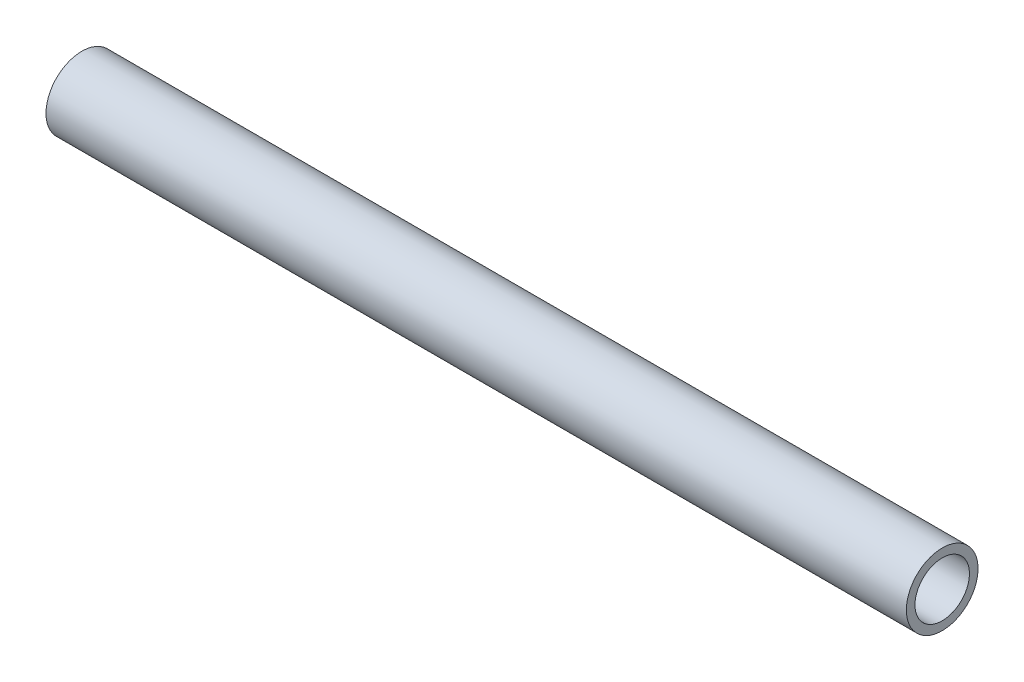
ISO-10303-21;
HEADER;
FILE_DESCRIPTION(('STEP AP214'),'2;1');
FILE_NAME('part.step','',(''),(''),'','','');
FILE_SCHEMA(('AUTOMOTIVE_DESIGN { 1 0 10303 214 1 1 1 1 }'));
ENDSEC;
DATA;
#1=APPLICATION_CONTEXT('core data for automotive mechanical design processes');
#2=APPLICATION_PROTOCOL_DEFINITION('international standard','automotive_design',2000,#1);
#3=PRODUCT_CONTEXT('',#1,'mechanical');
#4=PRODUCT('Part','Part','',(#3));
#5=PRODUCT_RELATED_PRODUCT_CATEGORY('part','',(#4));
#6=PRODUCT_DEFINITION_FORMATION('','',#4);
#7=PRODUCT_DEFINITION_CONTEXT('part definition',#1,'design');
#8=PRODUCT_DEFINITION('design','',#6,#7);
#9=PRODUCT_DEFINITION_SHAPE('','',#8);
#10=(LENGTH_UNIT() NAMED_UNIT(*) SI_UNIT(.MILLI.,.METRE.));
#11=(NAMED_UNIT(*) PLANE_ANGLE_UNIT() SI_UNIT($,.RADIAN.));
#12=(NAMED_UNIT(*) SI_UNIT($,.STERADIAN.) SOLID_ANGLE_UNIT());
#13=UNCERTAINTY_MEASURE_WITH_UNIT(LENGTH_MEASURE(1.E-05),#10,'distance_accuracy_value','');
#14=(GEOMETRIC_REPRESENTATION_CONTEXT(3) GLOBAL_UNCERTAINTY_ASSIGNED_CONTEXT((#13)) GLOBAL_UNIT_ASSIGNED_CONTEXT((#10,
#11,#12)) REPRESENTATION_CONTEXT('',''));
#15=CARTESIAN_POINT('',(0.,0.,0.));
#16=DIRECTION('',(0.,0.,1.));
#17=DIRECTION('',(1.,0.,0.));
#18=AXIS2_PLACEMENT_3D('',#15,#16,#17);
#19=CARTESIAN_POINT('',(304.8,0.,0.));
#20=DIRECTION('',(1.,0.,0.));
#21=DIRECTION('',(0.,0.,-1.));
#22=AXIS2_PLACEMENT_3D('',#19,#20,#21);
#23=PLANE('',#22);
#24=CARTESIAN_POINT('',(304.8,0.,0.));
#25=DIRECTION('',(1.,0.,0.));
#26=DIRECTION('',(0.,0.,-1.));
#27=AXIS2_PLACEMENT_3D('',#24,#25,#26);
#28=CIRCLE('',#27,12.7);
#29=CARTESIAN_POINT('',(304.8,0.,12.7));
#30=VERTEX_POINT('',#29);
#31=EDGE_CURVE('E10',#30,#30,#28,.T.);
#32=ORIENTED_EDGE('',*,*,#31,.T.);
#33=EDGE_LOOP('',(#32));
#34=FACE_BOUND('',#33,.T.);
#35=CARTESIAN_POINT('',(304.8,0.,0.));
#36=DIRECTION('',(1.,0.,0.));
#37=DIRECTION('',(0.,0.,-1.));
#38=AXIS2_PLACEMENT_3D('',#35,#36,#37);
#39=CIRCLE('',#38,9.652);
#40=CARTESIAN_POINT('',(304.8,0.,9.652));
#41=VERTEX_POINT('',#40);
#42=EDGE_CURVE('E47',#41,#41,#39,.T.);
#43=ORIENTED_EDGE('',*,*,#42,.F.);
#44=EDGE_LOOP('',(#43));
#45=FACE_BOUND('',#44,.T.);
#46=ADVANCED_FACE('F35',(#34,#45),#23,.T.);
#47=CARTESIAN_POINT('',(0.,0.,0.));
#48=DIRECTION('',(1.,0.,0.));
#49=DIRECTION('',(0.,0.,-1.));
#50=AXIS2_PLACEMENT_3D('',#47,#48,#49);
#51=PLANE('',#50);
#52=CARTESIAN_POINT('',(0.,0.,0.));
#53=DIRECTION('',(1.,0.,0.));
#54=DIRECTION('',(0.,0.,-1.));
#55=AXIS2_PLACEMENT_3D('',#52,#53,#54);
#56=CIRCLE('',#55,12.7);
#57=CARTESIAN_POINT('',(0.,0.,12.7));
#58=VERTEX_POINT('',#57);
#59=EDGE_CURVE('E39',#58,#58,#56,.T.);
#60=ORIENTED_EDGE('',*,*,#59,.F.);
#61=EDGE_LOOP('',(#60));
#62=FACE_BOUND('',#61,.T.);
#63=CARTESIAN_POINT('',(0.,0.,0.));
#64=DIRECTION('',(1.,0.,0.));
#65=DIRECTION('',(0.,0.,-1.));
#66=AXIS2_PLACEMENT_3D('',#63,#64,#65);
#67=CIRCLE('',#66,9.652);
#68=CARTESIAN_POINT('',(0.,0.,9.652));
#69=VERTEX_POINT('',#68);
#70=EDGE_CURVE('E49',#69,#69,#67,.T.);
#71=ORIENTED_EDGE('',*,*,#70,.T.);
#72=EDGE_LOOP('',(#71));
#73=FACE_BOUND('',#72,.T.);
#74=ADVANCED_FACE('F60',(#62,#73),#51,.F.);
#75=CARTESIAN_POINT('',(304.8,0.,0.));
#76=DIRECTION('',(-1.,0.,0.));
#77=DIRECTION('',(0.,0.,1.));
#78=AXIS2_PLACEMENT_3D('',#75,#76,#77);
#79=CYLINDRICAL_SURFACE('',#78,12.7);
#80=CARTESIAN_POINT('',(304.8,0.,12.7));
#81=CARTESIAN_POINT('',(301.625,0.,12.7));
#82=CARTESIAN_POINT('',(298.45,0.,12.7));
#83=CARTESIAN_POINT('',(292.1,0.,12.7));
#84=CARTESIAN_POINT('',(288.925,0.,12.7));
#85=CARTESIAN_POINT('',(282.575,0.,12.7));
#86=CARTESIAN_POINT('',(279.4,0.,12.7));
#87=CARTESIAN_POINT('',(273.05,0.,12.7));
#88=CARTESIAN_POINT('',(269.875,0.,12.7));
#89=CARTESIAN_POINT('',(263.525,0.,12.7));
#90=CARTESIAN_POINT('',(260.35,0.,12.7));
#91=CARTESIAN_POINT('',(254.,0.,12.7));
#92=CARTESIAN_POINT('',(250.825,0.,12.7));
#93=CARTESIAN_POINT('',(244.475,0.,12.7));
#94=CARTESIAN_POINT('',(241.3,0.,12.7));
#95=CARTESIAN_POINT('',(234.95,0.,12.7));
#96=CARTESIAN_POINT('',(231.775,0.,12.7));
#97=CARTESIAN_POINT('',(225.425,0.,12.7));
#98=CARTESIAN_POINT('',(222.25,0.,12.7));
#99=CARTESIAN_POINT('',(215.9,0.,12.7));
#100=CARTESIAN_POINT('',(212.725,0.,12.7));
#101=CARTESIAN_POINT('',(206.375,0.,12.7));
#102=CARTESIAN_POINT('',(203.2,0.,12.7));
#103=CARTESIAN_POINT('',(196.85,0.,12.7));
#104=CARTESIAN_POINT('',(193.675,0.,12.7));
#105=CARTESIAN_POINT('',(187.325,0.,12.7));
#106=CARTESIAN_POINT('',(184.15,0.,12.7));
#107=CARTESIAN_POINT('',(177.8,0.,12.7));
#108=CARTESIAN_POINT('',(174.625,0.,12.7));
#109=CARTESIAN_POINT('',(168.275,0.,12.7));
#110=CARTESIAN_POINT('',(165.1,0.,12.7));
#111=CARTESIAN_POINT('',(158.75,0.,12.7));
#112=CARTESIAN_POINT('',(155.575,0.,12.7));
#113=CARTESIAN_POINT('',(149.225,0.,12.7));
#114=CARTESIAN_POINT('',(146.05,0.,12.7));
#115=CARTESIAN_POINT('',(139.7,0.,12.7));
#116=CARTESIAN_POINT('',(136.525,0.,12.7));
#117=CARTESIAN_POINT('',(130.175,0.,12.7));
#118=CARTESIAN_POINT('',(127.,0.,12.7));
#119=CARTESIAN_POINT('',(120.65,0.,12.7));
#120=CARTESIAN_POINT('',(117.475,0.,12.7));
#121=CARTESIAN_POINT('',(111.125,0.,12.7));
#122=CARTESIAN_POINT('',(107.95,0.,12.7));
#123=CARTESIAN_POINT('',(101.6,0.,12.7));
#124=CARTESIAN_POINT('',(98.425,0.,12.7));
#125=CARTESIAN_POINT('',(92.075,0.,12.7));
#126=CARTESIAN_POINT('',(88.9,0.,12.7));
#127=CARTESIAN_POINT('',(82.55,0.,12.7));
#128=CARTESIAN_POINT('',(79.375,0.,12.7));
#129=CARTESIAN_POINT('',(73.025,0.,12.7));
#130=CARTESIAN_POINT('',(69.85,0.,12.7));
#131=CARTESIAN_POINT('',(63.5,0.,12.7));
#132=CARTESIAN_POINT('',(60.325,0.,12.7));
#133=CARTESIAN_POINT('',(53.975,0.,12.7));
#134=CARTESIAN_POINT('',(50.8,0.,12.7));
#135=CARTESIAN_POINT('',(44.45,0.,12.7));
#136=CARTESIAN_POINT('',(41.275,0.,12.7));
#137=CARTESIAN_POINT('',(34.925,0.,12.7));
#138=CARTESIAN_POINT('',(31.75,0.,12.7));
#139=CARTESIAN_POINT('',(25.4,0.,12.7));
#140=CARTESIAN_POINT('',(22.225,0.,12.7));
#141=CARTESIAN_POINT('',(15.875,0.,12.7));
#142=CARTESIAN_POINT('',(12.7,0.,12.7));
#143=CARTESIAN_POINT('',(6.35,0.,12.7));
#144=CARTESIAN_POINT('',(3.175,0.,12.7));
#145=CARTESIAN_POINT('',(0.,0.,12.7));
#146=B_SPLINE_CURVE_WITH_KNOTS('',3,(#80,#81,#82,#83,#84,#85,#86,#87,#88,#89,#90,#91,#92,#93,
#94,#95,#96,#97,#98,#99,#100,#101,#102,#103,#104,#105,#106,#107,#108,#109,#110,#111,#112,#113,
#114,#115,#116,#117,#118,#119,#120,#121,#122,#123,#124,#125,#126,#127,#128,#129,#130,#131,#132,
#133,#134,#135,#136,#137,#138,#139,#140,#141,#142,#143,#144,#145),.UNSPECIFIED.,.F.,.F.,(4,2,2,
2,2,2,2,2,2,2,2,2,2,2,2,2,2,2,2,2,2,2,2,2,2,2,2,2,2,2,2,2,4),(0.,9.52500000000001,19.05,28.575,
38.1,47.625,57.15,66.675,76.2,85.7250000000001,95.2500000000001,104.775,114.3,123.825,133.35,
142.875,152.4,161.925,171.45,180.975,190.5,200.025,209.55,219.075,228.6,238.125,247.65,257.175,
266.7,276.225,285.75,295.275,304.8),.UNSPECIFIED.);
#147=EDGE_CURVE('BSEAM37',#30,#58,#146,.T.);
#148=ORIENTED_EDGE('',*,*,#31,.F.);
#149=ORIENTED_EDGE('',*,*,#59,.T.);
#150=ORIENTED_EDGE('',*,*,#147,.T.);
#151=ORIENTED_EDGE('',*,*,#147,.F.);
#152=EDGE_LOOP('',(#148,#150,#149,#151));
#153=FACE_BOUND('',#152,.T.);
#154=ADVANCED_FACE('F37',(#153),#79,.T.);
#155=CARTESIAN_POINT('',(304.8,0.,0.));
#156=DIRECTION('',(-1.,0.,0.));
#157=DIRECTION('',(0.,0.,1.));
#158=AXIS2_PLACEMENT_3D('',#155,#156,#157);
#159=CYLINDRICAL_SURFACE('',#158,9.652);
#160=CARTESIAN_POINT('',(304.8,0.,9.652));
#161=CARTESIAN_POINT('',(301.625,0.,9.652));
#162=CARTESIAN_POINT('',(298.45,0.,9.652));
#163=CARTESIAN_POINT('',(292.1,0.,9.652));
#164=CARTESIAN_POINT('',(288.925,0.,9.652));
#165=CARTESIAN_POINT('',(282.575,0.,9.652));
#166=CARTESIAN_POINT('',(279.4,0.,9.652));
#167=CARTESIAN_POINT('',(273.05,0.,9.652));
#168=CARTESIAN_POINT('',(269.875,0.,9.652));
#169=CARTESIAN_POINT('',(263.525,0.,9.652));
#170=CARTESIAN_POINT('',(260.35,0.,9.652));
#171=CARTESIAN_POINT('',(254.,0.,9.652));
#172=CARTESIAN_POINT('',(250.825,0.,9.652));
#173=CARTESIAN_POINT('',(244.475,0.,9.652));
#174=CARTESIAN_POINT('',(241.3,0.,9.652));
#175=CARTESIAN_POINT('',(234.95,0.,9.652));
#176=CARTESIAN_POINT('',(231.775,0.,9.652));
#177=CARTESIAN_POINT('',(225.425,0.,9.652));
#178=CARTESIAN_POINT('',(222.25,0.,9.652));
#179=CARTESIAN_POINT('',(215.9,0.,9.652));
#180=CARTESIAN_POINT('',(212.725,0.,9.652));
#181=CARTESIAN_POINT('',(206.375,0.,9.652));
#182=CARTESIAN_POINT('',(203.2,0.,9.652));
#183=CARTESIAN_POINT('',(196.85,0.,9.652));
#184=CARTESIAN_POINT('',(193.675,0.,9.652));
#185=CARTESIAN_POINT('',(187.325,0.,9.652));
#186=CARTESIAN_POINT('',(184.15,0.,9.652));
#187=CARTESIAN_POINT('',(177.8,0.,9.652));
#188=CARTESIAN_POINT('',(174.625,0.,9.652));
#189=CARTESIAN_POINT('',(168.275,0.,9.652));
#190=CARTESIAN_POINT('',(165.1,0.,9.652));
#191=CARTESIAN_POINT('',(158.75,0.,9.652));
#192=CARTESIAN_POINT('',(155.575,0.,9.652));
#193=CARTESIAN_POINT('',(149.225,0.,9.652));
#194=CARTESIAN_POINT('',(146.05,0.,9.652));
#195=CARTESIAN_POINT('',(139.7,0.,9.652));
#196=CARTESIAN_POINT('',(136.525,0.,9.652));
#197=CARTESIAN_POINT('',(130.175,0.,9.652));
#198=CARTESIAN_POINT('',(127.,0.,9.652));
#199=CARTESIAN_POINT('',(120.65,0.,9.652));
#200=CARTESIAN_POINT('',(117.475,0.,9.652));
#201=CARTESIAN_POINT('',(111.125,0.,9.652));
#202=CARTESIAN_POINT('',(107.95,0.,9.652));
#203=CARTESIAN_POINT('',(101.6,0.,9.652));
#204=CARTESIAN_POINT('',(98.425,0.,9.652));
#205=CARTESIAN_POINT('',(92.075,0.,9.652));
#206=CARTESIAN_POINT('',(88.9,0.,9.652));
#207=CARTESIAN_POINT('',(82.55,0.,9.652));
#208=CARTESIAN_POINT('',(79.375,0.,9.652));
#209=CARTESIAN_POINT('',(73.025,0.,9.652));
#210=CARTESIAN_POINT('',(69.85,0.,9.652));
#211=CARTESIAN_POINT('',(63.5,0.,9.652));
#212=CARTESIAN_POINT('',(60.325,0.,9.652));
#213=CARTESIAN_POINT('',(53.975,0.,9.652));
#214=CARTESIAN_POINT('',(50.8,0.,9.652));
#215=CARTESIAN_POINT('',(44.45,0.,9.652));
#216=CARTESIAN_POINT('',(41.275,0.,9.652));
#217=CARTESIAN_POINT('',(34.925,0.,9.652));
#218=CARTESIAN_POINT('',(31.75,0.,9.652));
#219=CARTESIAN_POINT('',(25.4,0.,9.652));
#220=CARTESIAN_POINT('',(22.225,0.,9.652));
#221=CARTESIAN_POINT('',(15.875,0.,9.652));
#222=CARTESIAN_POINT('',(12.7,0.,9.652));
#223=CARTESIAN_POINT('',(6.35,0.,9.652));
#224=CARTESIAN_POINT('',(3.175,0.,9.652));
#225=CARTESIAN_POINT('',(0.,0.,9.652));
#226=B_SPLINE_CURVE_WITH_KNOTS('',3,(#160,#161,#162,#163,#164,#165,#166,#167,#168,#169,#170,
#171,#172,#173,#174,#175,#176,#177,#178,#179,#180,#181,#182,#183,#184,#185,#186,#187,#188,#189,
#190,#191,#192,#193,#194,#195,#196,#197,#198,#199,#200,#201,#202,#203,#204,#205,#206,#207,#208,
#209,#210,#211,#212,#213,#214,#215,#216,#217,#218,#219,#220,#221,#222,#223,#224,#225),
.UNSPECIFIED.,.F.,.F.,(4,2,2,2,2,2,2,2,2,2,2,2,2,2,2,2,2,2,2,2,2,2,2,2,2,2,2,2,2,2,2,2,4),(0.,
9.52499999999995,19.05,28.575,38.1,47.625,57.15,66.675,76.2,85.725,95.2499999999999,104.775,
114.3,123.825,133.35,142.875,152.4,161.925,171.45,180.975,190.5,200.025,209.55,219.075,228.6,
238.125,247.65,257.175,266.7,276.225,285.75,295.275,304.8),.UNSPECIFIED.);
#227=EDGE_CURVE('BSEAM56',#41,#69,#226,.T.);
#228=ORIENTED_EDGE('',*,*,#42,.T.);
#229=ORIENTED_EDGE('',*,*,#70,.F.);
#230=ORIENTED_EDGE('',*,*,#227,.T.);
#231=ORIENTED_EDGE('',*,*,#227,.F.);
#232=EDGE_LOOP('',(#228,#230,#229,#231));
#233=FACE_BOUND('',#232,.T.);
#234=ADVANCED_FACE('F56',(#233),#159,.F.);
#235=CLOSED_SHELL('',(#46,#74,#154,#234));
#236=MANIFOLD_SOLID_BREP('B2',#235);
#237=ADVANCED_BREP_SHAPE_REPRESENTATION('',(#18,#236),#14);
#238=SHAPE_DEFINITION_REPRESENTATION(#9,#237);
ENDSEC;
END-ISO-10303-21;
